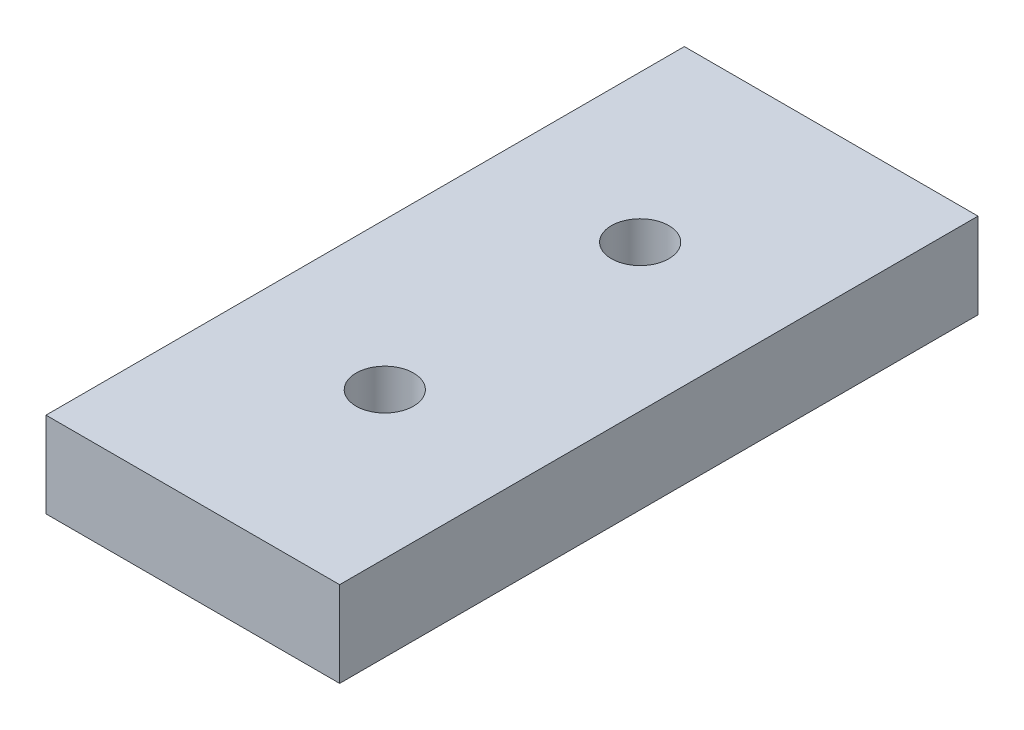
ISO-10303-21;
HEADER;
FILE_DESCRIPTION(('STEP AP214'),'2;1');
FILE_NAME('part.step','',(''),(''),'','','');
FILE_SCHEMA(('AUTOMOTIVE_DESIGN { 1 0 10303 214 1 1 1 1 }'));
ENDSEC;
DATA;
#1=APPLICATION_CONTEXT('core data for automotive mechanical design processes');
#2=APPLICATION_PROTOCOL_DEFINITION('international standard','automotive_design',2000,#1);
#3=PRODUCT_CONTEXT('',#1,'mechanical');
#4=PRODUCT('Part','Part','',(#3));
#5=PRODUCT_RELATED_PRODUCT_CATEGORY('part','',(#4));
#6=PRODUCT_DEFINITION_FORMATION('','',#4);
#7=PRODUCT_DEFINITION_CONTEXT('part definition',#1,'design');
#8=PRODUCT_DEFINITION('design','',#6,#7);
#9=PRODUCT_DEFINITION_SHAPE('','',#8);
#10=(LENGTH_UNIT() NAMED_UNIT(*) SI_UNIT(.MILLI.,.METRE.));
#11=(NAMED_UNIT(*) PLANE_ANGLE_UNIT() SI_UNIT($,.RADIAN.));
#12=(NAMED_UNIT(*) SI_UNIT($,.STERADIAN.) SOLID_ANGLE_UNIT());
#13=UNCERTAINTY_MEASURE_WITH_UNIT(LENGTH_MEASURE(1.E-05),#10,'distance_accuracy_value','');
#14=(GEOMETRIC_REPRESENTATION_CONTEXT(3) GLOBAL_UNCERTAINTY_ASSIGNED_CONTEXT((#13)) GLOBAL_UNIT_ASSIGNED_CONTEXT((#10,
#11,#12)) REPRESENTATION_CONTEXT('',''));
#15=CARTESIAN_POINT('',(0.,0.,0.));
#16=DIRECTION('',(0.,0.,1.));
#17=DIRECTION('',(1.,0.,0.));
#18=AXIS2_PLACEMENT_3D('',#15,#16,#17);
#19=CARTESIAN_POINT('',(0.,6.7,0.));
#20=DIRECTION('',(0.,-1.,0.));
#21=DIRECTION('',(0.,0.,-1.));
#22=AXIS2_PLACEMENT_3D('',#19,#20,#21);
#23=PLANE('',#22);
#24=DIRECTION('',(0.,0.,1.));
#25=VECTOR('',#24,1.);
#26=CARTESIAN_POINT('',(0.,6.7,0.));
#27=LINE('',#26,#25);
#28=CARTESIAN_POINT('',(0.,6.7,-50.));
#29=VERTEX_POINT('',#28);
#30=CARTESIAN_POINT('',(0.,6.7,0.));
#31=VERTEX_POINT('',#30);
#32=EDGE_CURVE('E85',#29,#31,#27,.T.);
#33=ORIENTED_EDGE('',*,*,#32,.T.);
#34=DIRECTION('',(1.,0.,0.));
#35=VECTOR('',#34,1.);
#36=CARTESIAN_POINT('',(0.,6.7,0.));
#37=LINE('',#36,#35);
#38=CARTESIAN_POINT('',(23.,6.7,0.));
#39=VERTEX_POINT('',#38);
#40=EDGE_CURVE('E80',#31,#39,#37,.T.);
#41=ORIENTED_EDGE('',*,*,#40,.T.);
#42=DIRECTION('',(0.,0.,-1.));
#43=VECTOR('',#42,1.);
#44=CARTESIAN_POINT('',(23.,6.7,0.));
#45=LINE('',#44,#43);
#46=CARTESIAN_POINT('',(23.,6.7,-50.));
#47=VERTEX_POINT('',#46);
#48=EDGE_CURVE('E83',#39,#47,#45,.T.);
#49=ORIENTED_EDGE('',*,*,#48,.T.);
#50=DIRECTION('',(-1.,0.,0.));
#51=VECTOR('',#50,1.);
#52=CARTESIAN_POINT('',(0.,6.7,-50.));
#53=LINE('',#52,#51);
#54=EDGE_CURVE('E50',#47,#29,#53,.T.);
#55=ORIENTED_EDGE('',*,*,#54,.T.);
#56=EDGE_LOOP('',(#33,#41,#49,#55));
#57=FACE_BOUND('',#56,.T.);
#58=CARTESIAN_POINT('',(11.5373869812332,6.7,-35.));
#59=DIRECTION('',(0.,1.,0.));
#60=DIRECTION('',(0.,0.,1.));
#61=AXIS2_PLACEMENT_3D('',#58,#59,#60);
#62=CIRCLE('',#61,2.25);
#63=CARTESIAN_POINT('',(11.5373869812332,6.7,-32.75));
#64=VERTEX_POINT('',#63);
#65=EDGE_CURVE('E100',#64,#64,#62,.T.);
#66=ORIENTED_EDGE('',*,*,#65,.F.);
#67=EDGE_LOOP('',(#66));
#68=FACE_BOUND('',#67,.T.);
#69=CARTESIAN_POINT('',(11.5373869812332,6.7,-15.));
#70=DIRECTION('',(0.,1.,0.));
#71=DIRECTION('',(0.,0.,1.));
#72=AXIS2_PLACEMENT_3D('',#69,#70,#71);
#73=CIRCLE('',#72,2.25);
#74=CARTESIAN_POINT('',(11.5373869812332,6.7,-12.75));
#75=VERTEX_POINT('',#74);
#76=EDGE_CURVE('E115',#75,#75,#73,.T.);
#77=ORIENTED_EDGE('',*,*,#76,.F.);
#78=EDGE_LOOP('',(#77));
#79=FACE_BOUND('',#78,.T.);
#80=ADVANCED_FACE('F33',(#57,#68,#79),#23,.F.);
#81=CARTESIAN_POINT('',(0.,0.,0.));
#82=DIRECTION('',(0.,-1.,0.));
#83=DIRECTION('',(0.,0.,-1.));
#84=AXIS2_PLACEMENT_3D('',#81,#82,#83);
#85=PLANE('',#84);
#86=CARTESIAN_POINT('',(11.5373869812332,0.,-35.));
#87=DIRECTION('',(0.,1.,0.));
#88=DIRECTION('',(0.,0.,1.));
#89=AXIS2_PLACEMENT_3D('',#86,#87,#88);
#90=CIRCLE('',#89,2.25);
#91=CARTESIAN_POINT('',(11.5373869812332,0.,-32.75));
#92=VERTEX_POINT('',#91);
#93=EDGE_CURVE('E112',#92,#92,#90,.T.);
#94=ORIENTED_EDGE('',*,*,#93,.T.);
#95=EDGE_LOOP('',(#94));
#96=FACE_BOUND('',#95,.T.);
#97=DIRECTION('',(0.,0.,1.));
#98=VECTOR('',#97,1.);
#99=CARTESIAN_POINT('',(0.,0.,0.));
#100=LINE('',#99,#98);
#101=CARTESIAN_POINT('',(0.,0.,-50.));
#102=VERTEX_POINT('',#101);
#103=CARTESIAN_POINT('',(0.,0.,0.));
#104=VERTEX_POINT('',#103);
#105=EDGE_CURVE('E97',#102,#104,#100,.T.);
#106=ORIENTED_EDGE('',*,*,#105,.F.);
#107=DIRECTION('',(-1.,0.,0.));
#108=VECTOR('',#107,1.);
#109=CARTESIAN_POINT('',(0.,0.,-50.));
#110=LINE('',#109,#108);
#111=CARTESIAN_POINT('',(23.,0.,-50.));
#112=VERTEX_POINT('',#111);
#113=EDGE_CURVE('E73',#112,#102,#110,.T.);
#114=ORIENTED_EDGE('',*,*,#113,.F.);
#115=DIRECTION('',(0.,0.,-1.));
#116=VECTOR('',#115,1.);
#117=CARTESIAN_POINT('',(23.,0.,0.));
#118=LINE('',#117,#116);
#119=CARTESIAN_POINT('',(23.,0.,0.));
#120=VERTEX_POINT('',#119);
#121=EDGE_CURVE('E67',#120,#112,#118,.T.);
#122=ORIENTED_EDGE('',*,*,#121,.F.);
#123=DIRECTION('',(1.,0.,0.));
#124=VECTOR('',#123,1.);
#125=CARTESIAN_POINT('',(0.,0.,0.));
#126=LINE('',#125,#124);
#127=EDGE_CURVE('E89',#104,#120,#126,.T.);
#128=ORIENTED_EDGE('',*,*,#127,.F.);
#129=EDGE_LOOP('',(#106,#114,#122,#128));
#130=FACE_BOUND('',#129,.T.);
#131=CARTESIAN_POINT('',(11.5373869812332,0.,-15.));
#132=DIRECTION('',(0.,1.,0.));
#133=DIRECTION('',(0.,0.,1.));
#134=AXIS2_PLACEMENT_3D('',#131,#132,#133);
#135=CIRCLE('',#134,2.25);
#136=CARTESIAN_POINT('',(11.5373869812332,0.,-12.75));
#137=VERTEX_POINT('',#136);
#138=EDGE_CURVE('E118',#137,#137,#135,.T.);
#139=ORIENTED_EDGE('',*,*,#138,.T.);
#140=EDGE_LOOP('',(#139));
#141=FACE_BOUND('',#140,.T.);
#142=ADVANCED_FACE('F108',(#96,#130,#141),#85,.T.);
#143=CARTESIAN_POINT('',(0.,6.7,0.));
#144=DIRECTION('',(1.,0.,0.));
#145=DIRECTION('',(0.,0.,-1.));
#146=AXIS2_PLACEMENT_3D('',#143,#144,#145);
#147=PLANE('',#146);
#148=ORIENTED_EDGE('',*,*,#105,.T.);
#149=DIRECTION('',(0.,-1.,0.));
#150=VECTOR('',#149,1.);
#151=CARTESIAN_POINT('',(0.,6.7,0.));
#152=LINE('',#151,#150);
#153=EDGE_CURVE('E11',#31,#104,#152,.T.);
#154=ORIENTED_EDGE('',*,*,#153,.F.);
#155=ORIENTED_EDGE('',*,*,#32,.F.);
#156=DIRECTION('',(0.,-1.,0.));
#157=VECTOR('',#156,1.);
#158=CARTESIAN_POINT('',(0.,6.7,-50.));
#159=LINE('',#158,#157);
#160=EDGE_CURVE('E93',#29,#102,#159,.T.);
#161=ORIENTED_EDGE('',*,*,#160,.T.);
#162=EDGE_LOOP('',(#148,#154,#155,#161));
#163=FACE_BOUND('',#162,.T.);
#164=ADVANCED_FACE('F35',(#163),#147,.F.);
#165=CARTESIAN_POINT('',(0.,6.7,0.));
#166=DIRECTION('',(0.,0.,-1.));
#167=DIRECTION('',(-1.,0.,0.));
#168=AXIS2_PLACEMENT_3D('',#165,#166,#167);
#169=PLANE('',#168);
#170=ORIENTED_EDGE('',*,*,#127,.T.);
#171=DIRECTION('',(0.,-1.,0.));
#172=VECTOR('',#171,1.);
#173=CARTESIAN_POINT('',(23.,6.7,0.));
#174=LINE('',#173,#172);
#175=EDGE_CURVE('E42',#39,#120,#174,.T.);
#176=ORIENTED_EDGE('',*,*,#175,.F.);
#177=ORIENTED_EDGE('',*,*,#40,.F.);
#178=ORIENTED_EDGE('',*,*,#153,.T.);
#179=EDGE_LOOP('',(#170,#176,#177,#178));
#180=FACE_BOUND('',#179,.T.);
#181=ADVANCED_FACE('F88',(#180),#169,.F.);
#182=CARTESIAN_POINT('',(23.,6.7,0.));
#183=DIRECTION('',(-1.,0.,0.));
#184=DIRECTION('',(0.,0.,1.));
#185=AXIS2_PLACEMENT_3D('',#182,#183,#184);
#186=PLANE('',#185);
#187=ORIENTED_EDGE('',*,*,#121,.T.);
#188=DIRECTION('',(0.,-1.,0.));
#189=VECTOR('',#188,1.);
#190=CARTESIAN_POINT('',(23.,6.7,-50.));
#191=LINE('',#190,#189);
#192=EDGE_CURVE('E90',#47,#112,#191,.T.);
#193=ORIENTED_EDGE('',*,*,#192,.F.);
#194=ORIENTED_EDGE('',*,*,#48,.F.);
#195=ORIENTED_EDGE('',*,*,#175,.T.);
#196=EDGE_LOOP('',(#187,#193,#194,#195));
#197=FACE_BOUND('',#196,.T.);
#198=ADVANCED_FACE('F91',(#197),#186,.F.);
#199=CARTESIAN_POINT('',(0.,6.7,-50.));
#200=DIRECTION('',(0.,0.,1.));
#201=DIRECTION('',(1.,0.,0.));
#202=AXIS2_PLACEMENT_3D('',#199,#200,#201);
#203=PLANE('',#202);
#204=ORIENTED_EDGE('',*,*,#113,.T.);
#205=ORIENTED_EDGE('',*,*,#160,.F.);
#206=ORIENTED_EDGE('',*,*,#54,.F.);
#207=ORIENTED_EDGE('',*,*,#192,.T.);
#208=EDGE_LOOP('',(#204,#205,#206,#207));
#209=FACE_BOUND('',#208,.T.);
#210=ADVANCED_FACE('F105',(#209),#203,.F.);
#211=CARTESIAN_POINT('',(11.5373869812332,6.7,-35.));
#212=DIRECTION('',(0.,-1.,0.));
#213=DIRECTION('',(0.,0.,-1.));
#214=AXIS2_PLACEMENT_3D('',#211,#212,#213);
#215=CYLINDRICAL_SURFACE('',#214,2.25);
#216=ORIENTED_EDGE('',*,*,#65,.T.);
#217=EDGE_LOOP('',(#216));
#218=FACE_BOUND('',#217,.T.);
#219=ORIENTED_EDGE('',*,*,#93,.F.);
#220=EDGE_LOOP('',(#219));
#221=FACE_BOUND('',#220,.T.);
#222=ADVANCED_FACE('F135',(#218,#221),#215,.F.);
#223=CARTESIAN_POINT('',(11.5373869812332,6.7,-15.));
#224=DIRECTION('',(0.,-1.,0.));
#225=DIRECTION('',(0.,0.,-1.));
#226=AXIS2_PLACEMENT_3D('',#223,#224,#225);
#227=CYLINDRICAL_SURFACE('',#226,2.25);
#228=ORIENTED_EDGE('',*,*,#76,.T.);
#229=EDGE_LOOP('',(#228));
#230=FACE_BOUND('',#229,.T.);
#231=ORIENTED_EDGE('',*,*,#138,.F.);
#232=EDGE_LOOP('',(#231));
#233=FACE_BOUND('',#232,.T.);
#234=ADVANCED_FACE('F124',(#230,#233),#227,.F.);
#235=CLOSED_SHELL('',(#80,#142,#164,#181,#198,#210,#222,#234));
#236=MANIFOLD_SOLID_BREP('B2',#235);
#237=ADVANCED_BREP_SHAPE_REPRESENTATION('',(#18,#236),#14);
#238=SHAPE_DEFINITION_REPRESENTATION(#9,#237);
ENDSEC;
END-ISO-10303-21;
